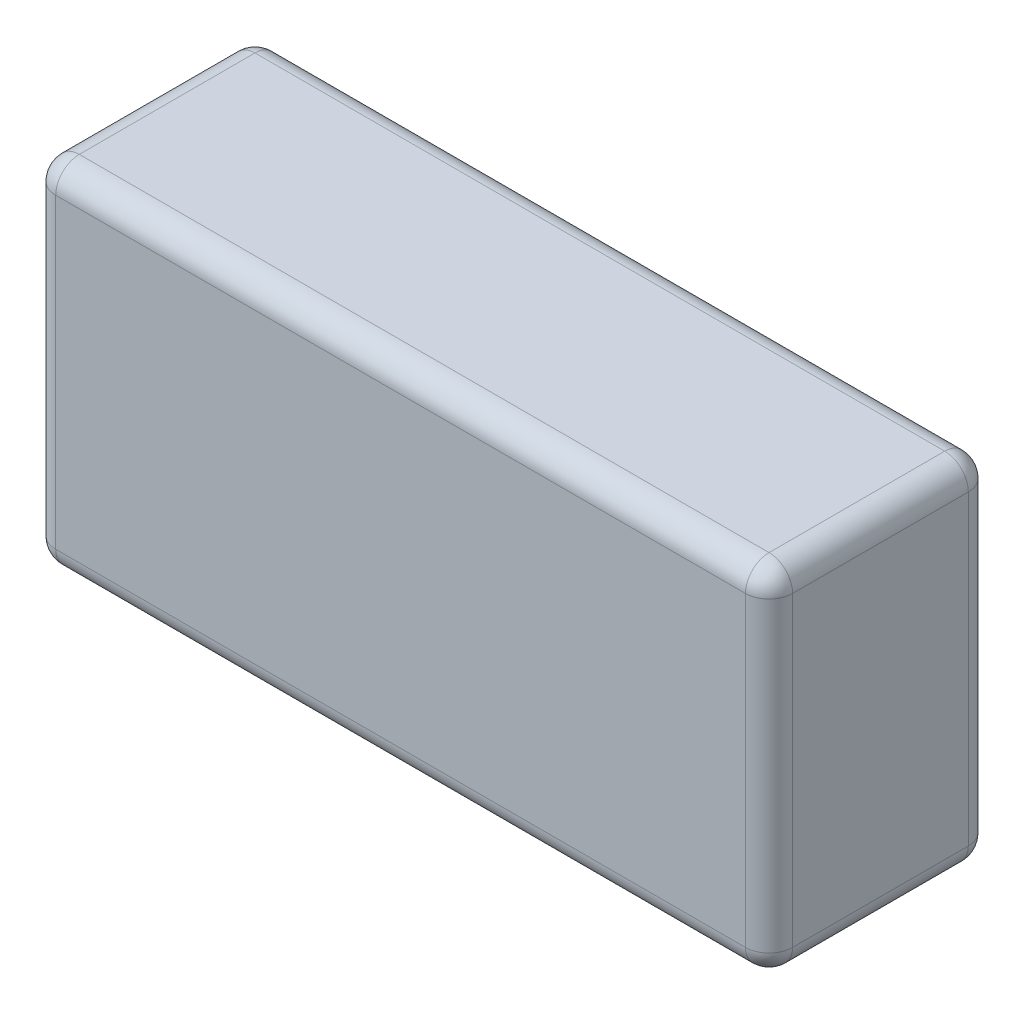
ISO-10303-21;
HEADER;
FILE_DESCRIPTION(('STEP AP214'),'2;1');
FILE_NAME('part.step','',(''),(''),'','','');
FILE_SCHEMA(('AUTOMOTIVE_DESIGN { 1 0 10303 214 1 1 1 1 }'));
ENDSEC;
DATA;
#1=APPLICATION_CONTEXT('core data for automotive mechanical design processes');
#2=APPLICATION_PROTOCOL_DEFINITION('international standard','automotive_design',2000,#1);
#3=PRODUCT_CONTEXT('',#1,'mechanical');
#4=PRODUCT('Part','Part','',(#3));
#5=PRODUCT_RELATED_PRODUCT_CATEGORY('part','',(#4));
#6=PRODUCT_DEFINITION_FORMATION('','',#4);
#7=PRODUCT_DEFINITION_CONTEXT('part definition',#1,'design');
#8=PRODUCT_DEFINITION('design','',#6,#7);
#9=PRODUCT_DEFINITION_SHAPE('','',#8);
#10=(LENGTH_UNIT() NAMED_UNIT(*) SI_UNIT(.MILLI.,.METRE.));
#11=(NAMED_UNIT(*) PLANE_ANGLE_UNIT() SI_UNIT($,.RADIAN.));
#12=(NAMED_UNIT(*) SI_UNIT($,.STERADIAN.) SOLID_ANGLE_UNIT());
#13=UNCERTAINTY_MEASURE_WITH_UNIT(LENGTH_MEASURE(1.E-05),#10,'distance_accuracy_value','');
#14=(GEOMETRIC_REPRESENTATION_CONTEXT(3) GLOBAL_UNCERTAINTY_ASSIGNED_CONTEXT((#13)) GLOBAL_UNIT_ASSIGNED_CONTEXT((#10,
#11,#12)) REPRESENTATION_CONTEXT('',''));
#15=CARTESIAN_POINT('',(0.,0.,0.));
#16=DIRECTION('',(0.,0.,1.));
#17=DIRECTION('',(1.,0.,0.));
#18=AXIS2_PLACEMENT_3D('',#15,#16,#17);
#19=CARTESIAN_POINT('',(0.,0.,18.9));
#20=DIRECTION('',(1.,0.,0.));
#21=DIRECTION('',(0.,0.,-1.));
#22=AXIS2_PLACEMENT_3D('',#19,#20,#21);
#23=PLANE('',#22);
#24=DIRECTION('',(0.,-1.,0.));
#25=VECTOR('',#24,1.);
#26=CARTESIAN_POINT('',(0.,0.,16.9));
#27=LINE('',#26,#25);
#28=CARTESIAN_POINT('',(0.,2.,16.9));
#29=VERTEX_POINT('',#28);
#30=CARTESIAN_POINT('',(0.,28.,16.9));
#31=VERTEX_POINT('',#30);
#32=EDGE_CURVE('E169',#29,#31,#27,.F.);
#33=ORIENTED_EDGE('',*,*,#32,.T.);
#34=DIRECTION('',(0.,0.,-1.));
#35=VECTOR('',#34,1.);
#36=CARTESIAN_POINT('',(0.,28.,18.9));
#37=LINE('',#36,#35);
#38=CARTESIAN_POINT('',(0.,28.,2.));
#39=VERTEX_POINT('',#38);
#40=EDGE_CURVE('E139',#31,#39,#37,.T.);
#41=ORIENTED_EDGE('',*,*,#40,.T.);
#42=DIRECTION('',(0.,-1.,0.));
#43=VECTOR('',#42,1.);
#44=CARTESIAN_POINT('',(0.,0.,2.));
#45=LINE('',#44,#43);
#46=CARTESIAN_POINT('',(0.,2.,2.));
#47=VERTEX_POINT('',#46);
#48=EDGE_CURVE('E159',#39,#47,#45,.T.);
#49=ORIENTED_EDGE('',*,*,#48,.T.);
#50=DIRECTION('',(0.,0.,-1.));
#51=VECTOR('',#50,1.);
#52=CARTESIAN_POINT('',(0.,2.,18.9));
#53=LINE('',#52,#51);
#54=EDGE_CURVE('E166',#47,#29,#53,.F.);
#55=ORIENTED_EDGE('',*,*,#54,.T.);
#56=EDGE_LOOP('',(#33,#41,#49,#55));
#57=FACE_BOUND('',#56,.T.);
#58=ADVANCED_FACE('F45',(#57),#23,.F.);
#59=CARTESIAN_POINT('',(0.,0.,18.9));
#60=DIRECTION('',(0.,1.,0.));
#61=DIRECTION('',(0.,0.,1.));
#62=AXIS2_PLACEMENT_3D('',#59,#60,#61);
#63=PLANE('',#62);
#64=DIRECTION('',(0.,0.,-1.));
#65=VECTOR('',#64,1.);
#66=CARTESIAN_POINT('',(2.,0.,18.9));
#67=LINE('',#66,#65);
#68=CARTESIAN_POINT('',(2.,0.,16.9));
#69=VERTEX_POINT('',#68);
#70=CARTESIAN_POINT('',(2.,0.,2.));
#71=VERTEX_POINT('',#70);
#72=EDGE_CURVE('E207',#69,#71,#67,.T.);
#73=ORIENTED_EDGE('',*,*,#72,.T.);
#74=DIRECTION('',(1.,0.,0.));
#75=VECTOR('',#74,1.);
#76=CARTESIAN_POINT('',(62.5,0.,2.));
#77=LINE('',#76,#75);
#78=CARTESIAN_POINT('',(60.5,0.,2.));
#79=VERTEX_POINT('',#78);
#80=EDGE_CURVE('E211',#71,#79,#77,.T.);
#81=ORIENTED_EDGE('',*,*,#80,.T.);
#82=DIRECTION('',(0.,0.,-1.));
#83=VECTOR('',#82,1.);
#84=CARTESIAN_POINT('',(60.5,0.,18.9));
#85=LINE('',#84,#83);
#86=CARTESIAN_POINT('',(60.5,0.,16.9));
#87=VERTEX_POINT('',#86);
#88=EDGE_CURVE('E204',#79,#87,#85,.F.);
#89=ORIENTED_EDGE('',*,*,#88,.T.);
#90=DIRECTION('',(1.,0.,0.));
#91=VECTOR('',#90,1.);
#92=CARTESIAN_POINT('',(0.,0.,16.9));
#93=LINE('',#92,#91);
#94=EDGE_CURVE('E201',#87,#69,#93,.F.);
#95=ORIENTED_EDGE('',*,*,#94,.T.);
#96=EDGE_LOOP('',(#73,#81,#89,#95));
#97=FACE_BOUND('',#96,.T.);
#98=ADVANCED_FACE('F337',(#97),#63,.F.);
#99=CARTESIAN_POINT('',(62.5,0.,18.9));
#100=DIRECTION('',(-1.,0.,0.));
#101=DIRECTION('',(0.,0.,1.));
#102=AXIS2_PLACEMENT_3D('',#99,#100,#101);
#103=PLANE('',#102);
#104=DIRECTION('',(0.,1.,0.));
#105=VECTOR('',#104,1.);
#106=CARTESIAN_POINT('',(62.5,0.,16.9));
#107=LINE('',#106,#105);
#108=CARTESIAN_POINT('',(62.5,28.,16.9));
#109=VERTEX_POINT('',#108);
#110=CARTESIAN_POINT('',(62.5,2.,16.9));
#111=VERTEX_POINT('',#110);
#112=EDGE_CURVE('E55',#109,#111,#107,.F.);
#113=ORIENTED_EDGE('',*,*,#112,.T.);
#114=DIRECTION('',(0.,0.,-1.));
#115=VECTOR('',#114,1.);
#116=CARTESIAN_POINT('',(62.5,2.,18.9));
#117=LINE('',#116,#115);
#118=CARTESIAN_POINT('',(62.5,2.,2.));
#119=VERTEX_POINT('',#118);
#120=EDGE_CURVE('E11',#111,#119,#117,.T.);
#121=ORIENTED_EDGE('',*,*,#120,.T.);
#122=DIRECTION('',(0.,1.,0.));
#123=VECTOR('',#122,1.);
#124=CARTESIAN_POINT('',(62.5,30.,2.));
#125=LINE('',#124,#123);
#126=CARTESIAN_POINT('',(62.5,28.,2.));
#127=VERTEX_POINT('',#126);
#128=EDGE_CURVE('E227',#119,#127,#125,.T.);
#129=ORIENTED_EDGE('',*,*,#128,.T.);
#130=DIRECTION('',(0.,0.,-1.));
#131=VECTOR('',#130,1.);
#132=CARTESIAN_POINT('',(62.5,28.,18.9));
#133=LINE('',#132,#131);
#134=EDGE_CURVE('E66',#127,#109,#133,.F.);
#135=ORIENTED_EDGE('',*,*,#134,.T.);
#136=EDGE_LOOP('',(#113,#121,#129,#135));
#137=FACE_BOUND('',#136,.T.);
#138=ADVANCED_FACE('F349',(#137),#103,.F.);
#139=CARTESIAN_POINT('',(0.,30.,18.9));
#140=DIRECTION('',(0.,-1.,0.));
#141=DIRECTION('',(0.,0.,-1.));
#142=AXIS2_PLACEMENT_3D('',#139,#140,#141);
#143=PLANE('',#142);
#144=DIRECTION('',(0.,0.,-1.));
#145=VECTOR('',#144,1.);
#146=CARTESIAN_POINT('',(60.5,30.,18.9));
#147=LINE('',#146,#145);
#148=CARTESIAN_POINT('',(60.5,30.,16.9));
#149=VERTEX_POINT('',#148);
#150=CARTESIAN_POINT('',(60.5,30.,2.));
#151=VERTEX_POINT('',#150);
#152=EDGE_CURVE('E176',#149,#151,#147,.T.);
#153=ORIENTED_EDGE('',*,*,#152,.T.);
#154=DIRECTION('',(-1.,0.,0.));
#155=VECTOR('',#154,1.);
#156=CARTESIAN_POINT('',(0.,30.,2.));
#157=LINE('',#156,#155);
#158=CARTESIAN_POINT('',(2.,30.,2.));
#159=VERTEX_POINT('',#158);
#160=EDGE_CURVE('E185',#151,#159,#157,.T.);
#161=ORIENTED_EDGE('',*,*,#160,.T.);
#162=DIRECTION('',(0.,0.,-1.));
#163=VECTOR('',#162,1.);
#164=CARTESIAN_POINT('',(2.,30.,18.9));
#165=LINE('',#164,#163);
#166=CARTESIAN_POINT('',(2.,30.,16.9));
#167=VERTEX_POINT('',#166);
#168=EDGE_CURVE('E141',#159,#167,#165,.F.);
#169=ORIENTED_EDGE('',*,*,#168,.T.);
#170=DIRECTION('',(-1.,0.,0.));
#171=VECTOR('',#170,1.);
#172=CARTESIAN_POINT('',(0.,30.,16.9));
#173=LINE('',#172,#171);
#174=EDGE_CURVE('E172',#167,#149,#173,.F.);
#175=ORIENTED_EDGE('',*,*,#174,.T.);
#176=EDGE_LOOP('',(#153,#161,#169,#175));
#177=FACE_BOUND('',#176,.T.);
#178=ADVANCED_FACE('F365',(#177),#143,.F.);
#179=CARTESIAN_POINT('',(0.,0.,18.9));
#180=DIRECTION('',(0.,0.,-1.));
#181=DIRECTION('',(-1.,0.,0.));
#182=AXIS2_PLACEMENT_3D('',#179,#180,#181);
#183=PLANE('',#182);
#184=DIRECTION('',(0.,-1.,0.));
#185=VECTOR('',#184,1.);
#186=CARTESIAN_POINT('',(2.,0.,18.9));
#187=LINE('',#186,#185);
#188=CARTESIAN_POINT('',(2.,28.,18.9));
#189=VERTEX_POINT('',#188);
#190=CARTESIAN_POINT('',(2.,2.,18.9));
#191=VERTEX_POINT('',#190);
#192=EDGE_CURVE('E194',#189,#191,#187,.T.);
#193=ORIENTED_EDGE('',*,*,#192,.T.);
#194=DIRECTION('',(1.,0.,0.));
#195=VECTOR('',#194,1.);
#196=CARTESIAN_POINT('',(0.,2.,18.9));
#197=LINE('',#196,#195);
#198=CARTESIAN_POINT('',(60.5,2.,18.9));
#199=VERTEX_POINT('',#198);
#200=EDGE_CURVE('E198',#191,#199,#197,.T.);
#201=ORIENTED_EDGE('',*,*,#200,.T.);
#202=DIRECTION('',(0.,1.,0.));
#203=VECTOR('',#202,1.);
#204=CARTESIAN_POINT('',(60.5,0.,18.9));
#205=LINE('',#204,#203);
#206=CARTESIAN_POINT('',(60.5,28.,18.9));
#207=VERTEX_POINT('',#206);
#208=EDGE_CURVE('E191',#199,#207,#205,.T.);
#209=ORIENTED_EDGE('',*,*,#208,.T.);
#210=DIRECTION('',(-1.,0.,0.));
#211=VECTOR('',#210,1.);
#212=CARTESIAN_POINT('',(0.,28.,18.9));
#213=LINE('',#212,#211);
#214=EDGE_CURVE('E188',#207,#189,#213,.T.);
#215=ORIENTED_EDGE('',*,*,#214,.T.);
#216=EDGE_LOOP('',(#193,#201,#209,#215));
#217=FACE_BOUND('',#216,.T.);
#218=ADVANCED_FACE('F328',(#217),#183,.F.);
#219=CARTESIAN_POINT('',(0.,0.,0.));
#220=DIRECTION('',(0.,0.,-1.));
#221=DIRECTION('',(-1.,0.,0.));
#222=AXIS2_PLACEMENT_3D('',#219,#220,#221);
#223=PLANE('',#222);
#224=DIRECTION('',(0.,1.,0.));
#225=VECTOR('',#224,1.);
#226=CARTESIAN_POINT('',(60.5,0.,0.));
#227=LINE('',#226,#225);
#228=CARTESIAN_POINT('',(60.5,28.,0.));
#229=VERTEX_POINT('',#228);
#230=CARTESIAN_POINT('',(60.5,2.,0.));
#231=VERTEX_POINT('',#230);
#232=EDGE_CURVE('E217',#229,#231,#227,.F.);
#233=ORIENTED_EDGE('',*,*,#232,.T.);
#234=DIRECTION('',(1.,0.,0.));
#235=VECTOR('',#234,1.);
#236=CARTESIAN_POINT('',(0.,2.,0.));
#237=LINE('',#236,#235);
#238=CARTESIAN_POINT('',(2.,2.,0.));
#239=VERTEX_POINT('',#238);
#240=EDGE_CURVE('E224',#231,#239,#237,.F.);
#241=ORIENTED_EDGE('',*,*,#240,.T.);
#242=DIRECTION('',(0.,-1.,0.));
#243=VECTOR('',#242,1.);
#244=CARTESIAN_POINT('',(2.,30.,0.));
#245=LINE('',#244,#243);
#246=CARTESIAN_POINT('',(2.,28.,0.));
#247=VERTEX_POINT('',#246);
#248=EDGE_CURVE('E220',#239,#247,#245,.F.);
#249=ORIENTED_EDGE('',*,*,#248,.T.);
#250=DIRECTION('',(-1.,0.,0.));
#251=VECTOR('',#250,1.);
#252=CARTESIAN_POINT('',(62.5,28.,0.));
#253=LINE('',#252,#251);
#254=EDGE_CURVE('E214',#247,#229,#253,.F.);
#255=ORIENTED_EDGE('',*,*,#254,.T.);
#256=EDGE_LOOP('',(#233,#241,#249,#255));
#257=FACE_BOUND('',#256,.T.);
#258=ADVANCED_FACE('F535',(#257),#223,.T.);
#259=CARTESIAN_POINT('',(60.5,2.,18.9));
#260=DIRECTION('',(0.,0.,-1.));
#261=DIRECTION('',(-1.,0.,0.));
#262=AXIS2_PLACEMENT_3D('',#259,#260,#261);
#263=CYLINDRICAL_SURFACE('',#262,2.);
#264=CARTESIAN_POINT('',(60.5,2.,16.9));
#265=DIRECTION('',(0.,0.,1.));
#266=DIRECTION('',(1.,0.,0.));
#267=AXIS2_PLACEMENT_3D('',#264,#265,#266);
#268=CIRCLE('',#267,2.);
#269=EDGE_CURVE('E49',#87,#111,#268,.T.);
#270=ORIENTED_EDGE('',*,*,#269,.F.);
#271=ORIENTED_EDGE('',*,*,#88,.F.);
#272=CARTESIAN_POINT('',(60.5,2.,2.));
#273=DIRECTION('',(0.,0.,-1.));
#274=DIRECTION('',(-1.,0.,0.));
#275=AXIS2_PLACEMENT_3D('',#272,#273,#274);
#276=CIRCLE('',#275,2.);
#277=EDGE_CURVE('E304',#119,#79,#276,.T.);
#278=ORIENTED_EDGE('',*,*,#277,.F.);
#279=ORIENTED_EDGE('',*,*,#120,.F.);
#280=EDGE_LOOP('',(#270,#271,#278,#279));
#281=FACE_BOUND('',#280,.T.);
#282=ADVANCED_FACE('F47',(#281),#263,.T.);
#283=CARTESIAN_POINT('',(60.5,2.,16.9));
#284=DIRECTION('',(1.,0.,0.));
#285=DIRECTION('',(0.,0.,-1.));
#286=AXIS2_PLACEMENT_3D('',#283,#284,#285);
#287=SPHERICAL_SURFACE('',#286,2.);
#288=CARTESIAN_POINT('',(60.5,2.,16.9));
#289=DIRECTION('',(1.,0.,0.));
#290=DIRECTION('',(0.,0.,-1.));
#291=AXIS2_PLACEMENT_3D('',#288,#289,#290);
#292=CIRCLE('',#291,2.);
#293=EDGE_CURVE('E297',#87,#199,#292,.F.);
#294=ORIENTED_EDGE('',*,*,#293,.F.);
#295=ORIENTED_EDGE('',*,*,#269,.T.);
#296=CARTESIAN_POINT('',(60.5,2.,16.9));
#297=DIRECTION('',(0.,-1.,0.));
#298=DIRECTION('',(0.,0.,-1.));
#299=AXIS2_PLACEMENT_3D('',#296,#297,#298);
#300=CIRCLE('',#299,2.);
#301=EDGE_CURVE('E301',#199,#111,#300,.F.);
#302=ORIENTED_EDGE('',*,*,#301,.F.);
#303=EDGE_LOOP('',(#294,#295,#302));
#304=FACE_BOUND('',#303,.T.);
#305=ADVANCED_FACE('F317',(#304),#287,.T.);
#306=CARTESIAN_POINT('',(60.5,2.,2.));
#307=DIRECTION('',(0.,-1.,0.));
#308=DIRECTION('',(0.,0.,-1.));
#309=AXIS2_PLACEMENT_3D('',#306,#307,#308);
#310=SPHERICAL_SURFACE('',#309,2.);
#311=CARTESIAN_POINT('',(60.5,2.,2.));
#312=DIRECTION('',(0.,-1.,0.));
#313=DIRECTION('',(0.,0.,-1.));
#314=AXIS2_PLACEMENT_3D('',#311,#312,#313);
#315=CIRCLE('',#314,2.);
#316=EDGE_CURVE('E289',#119,#231,#315,.F.);
#317=ORIENTED_EDGE('',*,*,#316,.F.);
#318=ORIENTED_EDGE('',*,*,#277,.T.);
#319=CARTESIAN_POINT('',(60.5,2.,2.));
#320=DIRECTION('',(1.,0.,0.));
#321=DIRECTION('',(0.,0.,-1.));
#322=AXIS2_PLACEMENT_3D('',#319,#320,#321);
#323=CIRCLE('',#322,2.);
#324=EDGE_CURVE('E293',#231,#79,#323,.F.);
#325=ORIENTED_EDGE('',*,*,#324,.F.);
#326=EDGE_LOOP('',(#317,#318,#325));
#327=FACE_BOUND('',#326,.T.);
#328=ADVANCED_FACE('F514',(#327),#310,.T.);
#329=CARTESIAN_POINT('',(60.5,0.,16.9));
#330=DIRECTION('',(0.,1.,0.));
#331=DIRECTION('',(0.,0.,1.));
#332=AXIS2_PLACEMENT_3D('',#329,#330,#331);
#333=CYLINDRICAL_SURFACE('',#332,2.);
#334=ORIENTED_EDGE('',*,*,#301,.T.);
#335=ORIENTED_EDGE('',*,*,#112,.F.);
#336=CARTESIAN_POINT('',(60.5,28.,16.9));
#337=DIRECTION('',(0.,1.,0.));
#338=DIRECTION('',(0.,0.,1.));
#339=AXIS2_PLACEMENT_3D('',#336,#337,#338);
#340=CIRCLE('',#339,2.);
#341=EDGE_CURVE('E281',#207,#109,#340,.T.);
#342=ORIENTED_EDGE('',*,*,#341,.F.);
#343=ORIENTED_EDGE('',*,*,#208,.F.);
#344=EDGE_LOOP('',(#334,#335,#342,#343));
#345=FACE_BOUND('',#344,.T.);
#346=ADVANCED_FACE('F323',(#345),#333,.T.);
#347=CARTESIAN_POINT('',(0.,2.,16.9));
#348=DIRECTION('',(1.,0.,0.));
#349=DIRECTION('',(0.,0.,-1.));
#350=AXIS2_PLACEMENT_3D('',#347,#348,#349);
#351=CYLINDRICAL_SURFACE('',#350,2.);
#352=ORIENTED_EDGE('',*,*,#293,.T.);
#353=ORIENTED_EDGE('',*,*,#200,.F.);
#354=CARTESIAN_POINT('',(2.,2.,16.9));
#355=DIRECTION('',(-1.,0.,0.));
#356=DIRECTION('',(0.,0.,1.));
#357=AXIS2_PLACEMENT_3D('',#354,#355,#356);
#358=CIRCLE('',#357,2.);
#359=EDGE_CURVE('E277',#69,#191,#358,.T.);
#360=ORIENTED_EDGE('',*,*,#359,.F.);
#361=ORIENTED_EDGE('',*,*,#94,.F.);
#362=EDGE_LOOP('',(#352,#353,#360,#361));
#363=FACE_BOUND('',#362,.T.);
#364=ADVANCED_FACE('F334',(#363),#351,.T.);
#365=CARTESIAN_POINT('',(2.,2.,18.9));
#366=DIRECTION('',(0.,0.,-1.));
#367=DIRECTION('',(-1.,0.,0.));
#368=AXIS2_PLACEMENT_3D('',#365,#366,#367);
#369=CYLINDRICAL_SURFACE('',#368,2.);
#370=CARTESIAN_POINT('',(2.,2.,2.));
#371=DIRECTION('',(0.,0.,-1.));
#372=DIRECTION('',(-1.,0.,0.));
#373=AXIS2_PLACEMENT_3D('',#370,#371,#372);
#374=CIRCLE('',#373,2.);
#375=EDGE_CURVE('E269',#71,#47,#374,.T.);
#376=ORIENTED_EDGE('',*,*,#375,.F.);
#377=ORIENTED_EDGE('',*,*,#72,.F.);
#378=CARTESIAN_POINT('',(2.,2.,16.9));
#379=DIRECTION('',(0.,0.,1.));
#380=DIRECTION('',(1.,0.,0.));
#381=AXIS2_PLACEMENT_3D('',#378,#379,#380);
#382=CIRCLE('',#381,2.);
#383=EDGE_CURVE('E273',#29,#69,#382,.T.);
#384=ORIENTED_EDGE('',*,*,#383,.F.);
#385=ORIENTED_EDGE('',*,*,#54,.F.);
#386=EDGE_LOOP('',(#376,#377,#384,#385));
#387=FACE_BOUND('',#386,.T.);
#388=ADVANCED_FACE('F341',(#387),#369,.T.);
#389=CARTESIAN_POINT('',(0.,2.,2.));
#390=DIRECTION('',(-1.,0.,0.));
#391=DIRECTION('',(0.,0.,1.));
#392=AXIS2_PLACEMENT_3D('',#389,#390,#391);
#393=CYLINDRICAL_SURFACE('',#392,2.);
#394=ORIENTED_EDGE('',*,*,#324,.T.);
#395=ORIENTED_EDGE('',*,*,#80,.F.);
#396=CARTESIAN_POINT('',(2.,2.,2.));
#397=DIRECTION('',(-1.,0.,0.));
#398=DIRECTION('',(0.,0.,1.));
#399=AXIS2_PLACEMENT_3D('',#396,#397,#398);
#400=CIRCLE('',#399,2.);
#401=EDGE_CURVE('E266',#239,#71,#400,.T.);
#402=ORIENTED_EDGE('',*,*,#401,.F.);
#403=ORIENTED_EDGE('',*,*,#240,.F.);
#404=EDGE_LOOP('',(#394,#395,#402,#403));
#405=FACE_BOUND('',#404,.T.);
#406=ADVANCED_FACE('F347',(#405),#393,.T.);
#407=CARTESIAN_POINT('',(60.5,0.,2.));
#408=DIRECTION('',(0.,-1.,0.));
#409=DIRECTION('',(0.,0.,-1.));
#410=AXIS2_PLACEMENT_3D('',#407,#408,#409);
#411=CYLINDRICAL_SURFACE('',#410,2.);
#412=ORIENTED_EDGE('',*,*,#316,.T.);
#413=ORIENTED_EDGE('',*,*,#232,.F.);
#414=CARTESIAN_POINT('',(60.5,28.,2.));
#415=DIRECTION('',(0.,1.,0.));
#416=DIRECTION('',(0.,0.,1.));
#417=AXIS2_PLACEMENT_3D('',#414,#415,#416);
#418=CIRCLE('',#417,2.);
#419=EDGE_CURVE('E262',#127,#229,#418,.T.);
#420=ORIENTED_EDGE('',*,*,#419,.F.);
#421=ORIENTED_EDGE('',*,*,#128,.F.);
#422=EDGE_LOOP('',(#412,#413,#420,#421));
#423=FACE_BOUND('',#422,.T.);
#424=ADVANCED_FACE('F358',(#423),#411,.T.);
#425=CARTESIAN_POINT('',(60.5,28.,18.9));
#426=DIRECTION('',(0.,0.,-1.));
#427=DIRECTION('',(-1.,0.,0.));
#428=AXIS2_PLACEMENT_3D('',#425,#426,#427);
#429=CYLINDRICAL_SURFACE('',#428,2.);
#430=CARTESIAN_POINT('',(60.5,28.,16.9));
#431=DIRECTION('',(0.,0.,1.));
#432=DIRECTION('',(1.,0.,0.));
#433=AXIS2_PLACEMENT_3D('',#430,#431,#432);
#434=CIRCLE('',#433,2.);
#435=EDGE_CURVE('E285',#109,#149,#434,.T.);
#436=ORIENTED_EDGE('',*,*,#435,.F.);
#437=ORIENTED_EDGE('',*,*,#134,.F.);
#438=CARTESIAN_POINT('',(60.5,28.,2.));
#439=DIRECTION('',(0.,0.,-1.));
#440=DIRECTION('',(-1.,0.,0.));
#441=AXIS2_PLACEMENT_3D('',#438,#439,#440);
#442=CIRCLE('',#441,2.);
#443=EDGE_CURVE('E258',#151,#127,#442,.T.);
#444=ORIENTED_EDGE('',*,*,#443,.F.);
#445=ORIENTED_EDGE('',*,*,#152,.F.);
#446=EDGE_LOOP('',(#436,#437,#444,#445));
#447=FACE_BOUND('',#446,.T.);
#448=ADVANCED_FACE('F354',(#447),#429,.T.);
#449=CARTESIAN_POINT('',(60.5,28.,16.9));
#450=DIRECTION('',(1.,0.,0.));
#451=DIRECTION('',(0.,0.,-1.));
#452=AXIS2_PLACEMENT_3D('',#449,#450,#451);
#453=SPHERICAL_SURFACE('',#452,2.);
#454=ORIENTED_EDGE('',*,*,#341,.T.);
#455=ORIENTED_EDGE('',*,*,#435,.T.);
#456=CARTESIAN_POINT('',(60.5,28.,16.9));
#457=DIRECTION('',(1.,0.,0.));
#458=DIRECTION('',(0.,0.,-1.));
#459=AXIS2_PLACEMENT_3D('',#456,#457,#458);
#460=CIRCLE('',#459,2.);
#461=EDGE_CURVE('E254',#207,#149,#460,.F.);
#462=ORIENTED_EDGE('',*,*,#461,.F.);
#463=EDGE_LOOP('',(#454,#455,#462));
#464=FACE_BOUND('',#463,.T.);
#465=ADVANCED_FACE('F368',(#464),#453,.T.);
#466=CARTESIAN_POINT('',(2.,2.,16.9));
#467=DIRECTION('',(0.,-1.,0.));
#468=DIRECTION('',(0.,0.,-1.));
#469=AXIS2_PLACEMENT_3D('',#466,#467,#468);
#470=SPHERICAL_SURFACE('',#469,2.);
#471=ORIENTED_EDGE('',*,*,#383,.T.);
#472=ORIENTED_EDGE('',*,*,#359,.T.);
#473=CARTESIAN_POINT('',(2.,2.,16.9));
#474=DIRECTION('',(0.,-1.,0.));
#475=DIRECTION('',(0.,0.,-1.));
#476=AXIS2_PLACEMENT_3D('',#473,#474,#475);
#477=CIRCLE('',#476,2.);
#478=EDGE_CURVE('E251',#29,#191,#477,.F.);
#479=ORIENTED_EDGE('',*,*,#478,.F.);
#480=EDGE_LOOP('',(#471,#472,#479));
#481=FACE_BOUND('',#480,.T.);
#482=ADVANCED_FACE('F378',(#481),#470,.T.);
#483=CARTESIAN_POINT('',(2.,2.,2.));
#484=DIRECTION('',(0.,-1.,0.));
#485=DIRECTION('',(0.,0.,-1.));
#486=AXIS2_PLACEMENT_3D('',#483,#484,#485);
#487=SPHERICAL_SURFACE('',#486,2.);
#488=ORIENTED_EDGE('',*,*,#401,.T.);
#489=ORIENTED_EDGE('',*,*,#375,.T.);
#490=CARTESIAN_POINT('',(2.,2.,2.));
#491=DIRECTION('',(0.,-1.,0.));
#492=DIRECTION('',(0.,0.,-1.));
#493=AXIS2_PLACEMENT_3D('',#490,#491,#492);
#494=CIRCLE('',#493,2.);
#495=EDGE_CURVE('E162',#239,#47,#494,.F.);
#496=ORIENTED_EDGE('',*,*,#495,.F.);
#497=EDGE_LOOP('',(#488,#489,#496));
#498=FACE_BOUND('',#497,.T.);
#499=ADVANCED_FACE('F380',(#498),#487,.T.);
#500=CARTESIAN_POINT('',(60.5,28.,2.));
#501=DIRECTION('',(1.,0.,0.));
#502=DIRECTION('',(0.,0.,-1.));
#503=AXIS2_PLACEMENT_3D('',#500,#501,#502);
#504=SPHERICAL_SURFACE('',#503,2.);
#505=ORIENTED_EDGE('',*,*,#443,.T.);
#506=ORIENTED_EDGE('',*,*,#419,.T.);
#507=CARTESIAN_POINT('',(60.5,28.,2.));
#508=DIRECTION('',(1.,0.,0.));
#509=DIRECTION('',(0.,0.,-1.));
#510=AXIS2_PLACEMENT_3D('',#507,#508,#509);
#511=CIRCLE('',#510,2.);
#512=EDGE_CURVE('E245',#151,#229,#511,.F.);
#513=ORIENTED_EDGE('',*,*,#512,.F.);
#514=EDGE_LOOP('',(#505,#506,#513));
#515=FACE_BOUND('',#514,.T.);
#516=ADVANCED_FACE('F360',(#515),#504,.T.);
#517=CARTESIAN_POINT('',(0.,28.,16.9));
#518=DIRECTION('',(-1.,0.,0.));
#519=DIRECTION('',(0.,0.,1.));
#520=AXIS2_PLACEMENT_3D('',#517,#518,#519);
#521=CYLINDRICAL_SURFACE('',#520,2.);
#522=ORIENTED_EDGE('',*,*,#461,.T.);
#523=ORIENTED_EDGE('',*,*,#174,.F.);
#524=CARTESIAN_POINT('',(2.,28.,16.9));
#525=DIRECTION('',(-1.,0.,0.));
#526=DIRECTION('',(0.,0.,1.));
#527=AXIS2_PLACEMENT_3D('',#524,#525,#526);
#528=CIRCLE('',#527,2.);
#529=EDGE_CURVE('E241',#189,#167,#528,.T.);
#530=ORIENTED_EDGE('',*,*,#529,.F.);
#531=ORIENTED_EDGE('',*,*,#214,.F.);
#532=EDGE_LOOP('',(#522,#523,#530,#531));
#533=FACE_BOUND('',#532,.T.);
#534=ADVANCED_FACE('F370',(#533),#521,.T.);
#535=CARTESIAN_POINT('',(2.,0.,16.9));
#536=DIRECTION('',(0.,-1.,0.));
#537=DIRECTION('',(0.,0.,-1.));
#538=AXIS2_PLACEMENT_3D('',#535,#536,#537);
#539=CYLINDRICAL_SURFACE('',#538,2.);
#540=ORIENTED_EDGE('',*,*,#478,.T.);
#541=ORIENTED_EDGE('',*,*,#192,.F.);
#542=CARTESIAN_POINT('',(2.,28.,16.9));
#543=DIRECTION('',(0.,1.,0.));
#544=DIRECTION('',(0.,0.,1.));
#545=AXIS2_PLACEMENT_3D('',#542,#543,#544);
#546=CIRCLE('',#545,2.);
#547=EDGE_CURVE('E156',#31,#189,#546,.T.);
#548=ORIENTED_EDGE('',*,*,#547,.F.);
#549=ORIENTED_EDGE('',*,*,#32,.F.);
#550=EDGE_LOOP('',(#540,#541,#548,#549));
#551=FACE_BOUND('',#550,.T.);
#552=ADVANCED_FACE('F376',(#551),#539,.T.);
#553=CARTESIAN_POINT('',(2.,0.,2.));
#554=DIRECTION('',(0.,1.,0.));
#555=DIRECTION('',(0.,0.,1.));
#556=AXIS2_PLACEMENT_3D('',#553,#554,#555);
#557=CYLINDRICAL_SURFACE('',#556,2.);
#558=ORIENTED_EDGE('',*,*,#495,.T.);
#559=ORIENTED_EDGE('',*,*,#48,.F.);
#560=CARTESIAN_POINT('',(2.,28.,2.));
#561=DIRECTION('',(0.,1.,0.));
#562=DIRECTION('',(0.,0.,1.));
#563=AXIS2_PLACEMENT_3D('',#560,#561,#562);
#564=CIRCLE('',#563,2.);
#565=EDGE_CURVE('E147',#247,#39,#564,.T.);
#566=ORIENTED_EDGE('',*,*,#565,.F.);
#567=ORIENTED_EDGE('',*,*,#248,.F.);
#568=EDGE_LOOP('',(#558,#559,#566,#567));
#569=FACE_BOUND('',#568,.T.);
#570=ADVANCED_FACE('F160',(#569),#557,.T.);
#571=CARTESIAN_POINT('',(0.,28.,2.));
#572=DIRECTION('',(1.,0.,0.));
#573=DIRECTION('',(0.,0.,-1.));
#574=AXIS2_PLACEMENT_3D('',#571,#572,#573);
#575=CYLINDRICAL_SURFACE('',#574,2.);
#576=ORIENTED_EDGE('',*,*,#512,.T.);
#577=ORIENTED_EDGE('',*,*,#254,.F.);
#578=CARTESIAN_POINT('',(2.,28.,2.));
#579=DIRECTION('',(-1.,0.,0.));
#580=DIRECTION('',(0.,0.,1.));
#581=AXIS2_PLACEMENT_3D('',#578,#579,#580);
#582=CIRCLE('',#581,2.);
#583=EDGE_CURVE('E151',#159,#247,#582,.T.);
#584=ORIENTED_EDGE('',*,*,#583,.F.);
#585=ORIENTED_EDGE('',*,*,#160,.F.);
#586=EDGE_LOOP('',(#576,#577,#584,#585));
#587=FACE_BOUND('',#586,.T.);
#588=ADVANCED_FACE('F363',(#587),#575,.T.);
#589=CARTESIAN_POINT('',(2.,28.,16.9));
#590=DIRECTION('',(0.,0.,1.));
#591=DIRECTION('',(1.,0.,0.));
#592=AXIS2_PLACEMENT_3D('',#589,#590,#591);
#593=SPHERICAL_SURFACE('',#592,2.);
#594=ORIENTED_EDGE('',*,*,#547,.T.);
#595=ORIENTED_EDGE('',*,*,#529,.T.);
#596=CARTESIAN_POINT('',(2.,28.,16.9));
#597=DIRECTION('',(0.,0.,1.));
#598=DIRECTION('',(1.,0.,0.));
#599=AXIS2_PLACEMENT_3D('',#596,#597,#598);
#600=CIRCLE('',#599,2.);
#601=EDGE_CURVE('E144',#31,#167,#600,.F.);
#602=ORIENTED_EDGE('',*,*,#601,.F.);
#603=EDGE_LOOP('',(#594,#595,#602));
#604=FACE_BOUND('',#603,.T.);
#605=ADVANCED_FACE('F374',(#604),#593,.T.);
#606=CARTESIAN_POINT('',(2.,28.,2.));
#607=DIRECTION('',(0.,0.,-1.));
#608=DIRECTION('',(-1.,0.,0.));
#609=AXIS2_PLACEMENT_3D('',#606,#607,#608);
#610=SPHERICAL_SURFACE('',#609,2.);
#611=ORIENTED_EDGE('',*,*,#583,.T.);
#612=ORIENTED_EDGE('',*,*,#565,.T.);
#613=CARTESIAN_POINT('',(2.,28.,2.));
#614=DIRECTION('',(0.,0.,-1.));
#615=DIRECTION('',(-1.,0.,0.));
#616=AXIS2_PLACEMENT_3D('',#613,#614,#615);
#617=CIRCLE('',#616,2.);
#618=EDGE_CURVE('E135',#159,#39,#617,.F.);
#619=ORIENTED_EDGE('',*,*,#618,.F.);
#620=EDGE_LOOP('',(#611,#612,#619));
#621=FACE_BOUND('',#620,.T.);
#622=ADVANCED_FACE('F149',(#621),#610,.T.);
#623=CARTESIAN_POINT('',(2.,28.,18.9));
#624=DIRECTION('',(0.,0.,-1.));
#625=DIRECTION('',(-1.,0.,0.));
#626=AXIS2_PLACEMENT_3D('',#623,#624,#625);
#627=CYLINDRICAL_SURFACE('',#626,2.);
#628=ORIENTED_EDGE('',*,*,#601,.T.);
#629=ORIENTED_EDGE('',*,*,#168,.F.);
#630=ORIENTED_EDGE('',*,*,#618,.T.);
#631=ORIENTED_EDGE('',*,*,#40,.F.);
#632=EDGE_LOOP('',(#628,#629,#630,#631));
#633=FACE_BOUND('',#632,.T.);
#634=ADVANCED_FACE('F137',(#633),#627,.T.);
#635=CLOSED_SHELL('',(#58,#98,#138,#178,#218,#258,#282,#305,#328,#346,#364,#388,#406,#424,#448,
#465,#482,#499,#516,#534,#552,#570,#588,#605,#622,#634));
#636=MANIFOLD_SOLID_BREP('B2',#635);
#637=ADVANCED_BREP_SHAPE_REPRESENTATION('',(#18,#636),#14);
#638=SHAPE_DEFINITION_REPRESENTATION(#9,#637);
ENDSEC;
END-ISO-10303-21;
